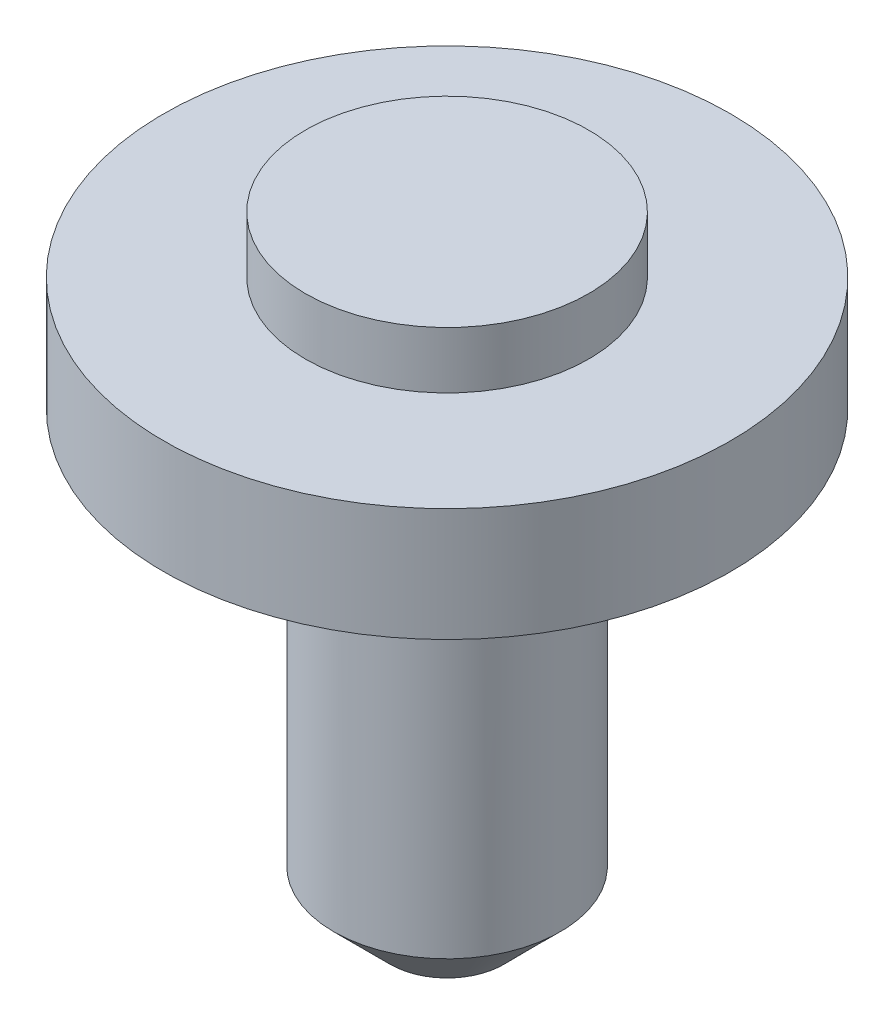
ISO-10303-21;
HEADER;
FILE_DESCRIPTION(('STEP AP214'),'2;1');
FILE_NAME('part.step','',(''),(''),'','','');
FILE_SCHEMA(('AUTOMOTIVE_DESIGN { 1 0 10303 214 1 1 1 1 }'));
ENDSEC;
DATA;
#1=APPLICATION_CONTEXT('core data for automotive mechanical design processes');
#2=APPLICATION_PROTOCOL_DEFINITION('international standard','automotive_design',2000,#1);
#3=PRODUCT_CONTEXT('',#1,'mechanical');
#4=PRODUCT('Part','Part','',(#3));
#5=PRODUCT_RELATED_PRODUCT_CATEGORY('part','',(#4));
#6=PRODUCT_DEFINITION_FORMATION('','',#4);
#7=PRODUCT_DEFINITION_CONTEXT('part definition',#1,'design');
#8=PRODUCT_DEFINITION('design','',#6,#7);
#9=PRODUCT_DEFINITION_SHAPE('','',#8);
#10=(LENGTH_UNIT() NAMED_UNIT(*) SI_UNIT(.MILLI.,.METRE.));
#11=(NAMED_UNIT(*) PLANE_ANGLE_UNIT() SI_UNIT($,.RADIAN.));
#12=(NAMED_UNIT(*) SI_UNIT($,.STERADIAN.) SOLID_ANGLE_UNIT());
#13=UNCERTAINTY_MEASURE_WITH_UNIT(LENGTH_MEASURE(1.E-05),#10,'distance_accuracy_value','');
#14=(GEOMETRIC_REPRESENTATION_CONTEXT(3) GLOBAL_UNCERTAINTY_ASSIGNED_CONTEXT((#13)) GLOBAL_UNIT_ASSIGNED_CONTEXT((#10,
#11,#12)) REPRESENTATION_CONTEXT('',''));
#15=CARTESIAN_POINT('',(0.,0.,0.));
#16=DIRECTION('',(0.,0.,1.));
#17=DIRECTION('',(1.,0.,0.));
#18=AXIS2_PLACEMENT_3D('',#15,#16,#17);
#19=CARTESIAN_POINT('',(0.,10.,0.));
#20=DIRECTION('',(0.,-1.,0.));
#21=DIRECTION('',(0.,0.,-1.));
#22=AXIS2_PLACEMENT_3D('',#19,#20,#21);
#23=PLANE('',#22);
#24=CARTESIAN_POINT('',(0.,10.,0.));
#25=DIRECTION('',(0.,1.,0.));
#26=DIRECTION('',(0.,0.,1.));
#27=AXIS2_PLACEMENT_3D('',#24,#25,#26);
#28=CIRCLE('',#27,2.5);
#29=CARTESIAN_POINT('',(0.,10.,2.5));
#30=VERTEX_POINT('',#29);
#31=EDGE_CURVE('E10',#30,#30,#28,.T.);
#32=ORIENTED_EDGE('',*,*,#31,.F.);
#33=EDGE_LOOP('',(#32));
#34=FACE_BOUND('',#33,.T.);
#35=CARTESIAN_POINT('',(0.,10.,0.));
#36=DIRECTION('',(0.,-1.,0.));
#37=DIRECTION('',(0.,0.,-1.));
#38=AXIS2_PLACEMENT_3D('',#35,#36,#37);
#39=CIRCLE('',#38,5.);
#40=CARTESIAN_POINT('',(0.,10.,-5.));
#41=VERTEX_POINT('',#40);
#42=EDGE_CURVE('E72',#41,#41,#39,.T.);
#43=ORIENTED_EDGE('',*,*,#42,.F.);
#44=EDGE_LOOP('',(#43));
#45=FACE_BOUND('',#44,.T.);
#46=ADVANCED_FACE('F37',(#34,#45),#23,.F.);
#47=CARTESIAN_POINT('',(0.,0.,0.));
#48=DIRECTION('',(0.,-1.,0.));
#49=DIRECTION('',(0.,0.,-1.));
#50=AXIS2_PLACEMENT_3D('',#47,#48,#49);
#51=CYLINDRICAL_SURFACE('',#50,5.);
#52=CARTESIAN_POINT('',(0.,8.,0.));
#53=DIRECTION('',(0.,-1.,0.));
#54=DIRECTION('',(0.,0.,-1.));
#55=AXIS2_PLACEMENT_3D('',#52,#53,#54);
#56=CIRCLE('',#55,5.);
#57=CARTESIAN_POINT('',(0.,8.,-5.));
#58=VERTEX_POINT('',#57);
#59=EDGE_CURVE('E69',#58,#58,#56,.T.);
#60=ORIENTED_EDGE('',*,*,#59,.F.);
#61=EDGE_LOOP('',(#60));
#62=FACE_BOUND('',#61,.T.);
#63=ORIENTED_EDGE('',*,*,#42,.T.);
#64=EDGE_LOOP('',(#63));
#65=FACE_BOUND('',#64,.T.);
#66=ADVANCED_FACE('F96',(#62,#65),#51,.T.);
#67=CARTESIAN_POINT('',(-5.,8.,0.));
#68=DIRECTION('',(0.,1.,0.));
#69=DIRECTION('',(0.,0.,1.));
#70=AXIS2_PLACEMENT_3D('',#67,#68,#69);
#71=PLANE('',#70);
#72=CARTESIAN_POINT('',(0.,8.,0.));
#73=DIRECTION('',(0.,-1.,0.));
#74=DIRECTION('',(0.,0.,-1.));
#75=AXIS2_PLACEMENT_3D('',#72,#73,#74);
#76=CIRCLE('',#75,2.5);
#77=CARTESIAN_POINT('',(0.,8.,-2.5));
#78=VERTEX_POINT('',#77);
#79=EDGE_CURVE('E66',#78,#78,#76,.T.);
#80=ORIENTED_EDGE('',*,*,#79,.F.);
#81=EDGE_LOOP('',(#80));
#82=FACE_BOUND('',#81,.T.);
#83=ORIENTED_EDGE('',*,*,#59,.T.);
#84=EDGE_LOOP('',(#83));
#85=FACE_BOUND('',#84,.T.);
#86=ADVANCED_FACE('F101',(#82,#85),#71,.F.);
#87=CARTESIAN_POINT('',(0.,0.,0.));
#88=DIRECTION('',(0.,-1.,0.));
#89=DIRECTION('',(0.,0.,-1.));
#90=AXIS2_PLACEMENT_3D('',#87,#88,#89);
#91=CYLINDRICAL_SURFACE('',#90,2.5);
#92=CARTESIAN_POINT('',(0.,7.,0.));
#93=DIRECTION('',(0.,-1.,0.));
#94=DIRECTION('',(0.,0.,-1.));
#95=AXIS2_PLACEMENT_3D('',#92,#93,#94);
#96=CIRCLE('',#95,2.5);
#97=CARTESIAN_POINT('',(0.,7.,-2.5));
#98=VERTEX_POINT('',#97);
#99=EDGE_CURVE('E63',#98,#98,#96,.T.);
#100=ORIENTED_EDGE('',*,*,#99,.F.);
#101=EDGE_LOOP('',(#100));
#102=FACE_BOUND('',#101,.T.);
#103=ORIENTED_EDGE('',*,*,#79,.T.);
#104=EDGE_LOOP('',(#103));
#105=FACE_BOUND('',#104,.T.);
#106=ADVANCED_FACE('F108',(#102,#105),#91,.T.);
#107=CARTESIAN_POINT('',(-2.5,7.,0.));
#108=DIRECTION('',(0.,1.,0.));
#109=DIRECTION('',(0.,0.,1.));
#110=AXIS2_PLACEMENT_3D('',#107,#108,#109);
#111=PLANE('',#110);
#112=CARTESIAN_POINT('',(0.,7.,0.));
#113=DIRECTION('',(0.,-1.,0.));
#114=DIRECTION('',(0.,0.,-1.));
#115=AXIS2_PLACEMENT_3D('',#112,#113,#114);
#116=CIRCLE('',#115,2.);
#117=CARTESIAN_POINT('',(0.,7.,-2.));
#118=VERTEX_POINT('',#117);
#119=EDGE_CURVE('E60',#118,#118,#116,.T.);
#120=ORIENTED_EDGE('',*,*,#119,.F.);
#121=EDGE_LOOP('',(#120));
#122=FACE_BOUND('',#121,.T.);
#123=ORIENTED_EDGE('',*,*,#99,.T.);
#124=EDGE_LOOP('',(#123));
#125=FACE_BOUND('',#124,.T.);
#126=ADVANCED_FACE('F112',(#122,#125),#111,.F.);
#127=CARTESIAN_POINT('',(0.,0.,0.));
#128=DIRECTION('',(0.,-1.,0.));
#129=DIRECTION('',(0.,0.,-1.));
#130=AXIS2_PLACEMENT_3D('',#127,#128,#129);
#131=CYLINDRICAL_SURFACE('',#130,2.);
#132=CARTESIAN_POINT('',(0.,0.999999999999999,0.));
#133=DIRECTION('',(0.,1.,0.));
#134=DIRECTION('',(0.,0.,1.));
#135=AXIS2_PLACEMENT_3D('',#132,#133,#134);
#136=CIRCLE('',#135,2.);
#137=CARTESIAN_POINT('',(0.,0.999999999999999,2.));
#138=VERTEX_POINT('',#137);
#139=EDGE_CURVE('E42',#138,#138,#136,.T.);
#140=ORIENTED_EDGE('',*,*,#139,.T.);
#141=EDGE_LOOP('',(#140));
#142=FACE_BOUND('',#141,.T.);
#143=ORIENTED_EDGE('',*,*,#119,.T.);
#144=EDGE_LOOP('',(#143));
#145=FACE_BOUND('',#144,.T.);
#146=ADVANCED_FACE('F116',(#142,#145),#131,.T.);
#147=CARTESIAN_POINT('',(-2.,0.,0.));
#148=DIRECTION('',(0.,1.,0.));
#149=DIRECTION('',(0.,0.,1.));
#150=AXIS2_PLACEMENT_3D('',#147,#148,#149);
#151=PLANE('',#150);
#152=CARTESIAN_POINT('',(0.,0.,0.));
#153=DIRECTION('',(0.,1.,0.));
#154=DIRECTION('',(0.,0.,1.));
#155=AXIS2_PLACEMENT_3D('',#152,#153,#154);
#156=CIRCLE('',#155,1.);
#157=CARTESIAN_POINT('',(0.,0.,1.));
#158=VERTEX_POINT('',#157);
#159=EDGE_CURVE('E50',#158,#158,#156,.F.);
#160=ORIENTED_EDGE('',*,*,#159,.T.);
#161=EDGE_LOOP('',(#160));
#162=FACE_BOUND('',#161,.T.);
#163=CARTESIAN_POINT('',(0.,0.,0.));
#164=DIRECTION('',(0.,-1.,0.));
#165=DIRECTION('',(0.,0.,-1.));
#166=AXIS2_PLACEMENT_3D('',#163,#164,#165);
#167=CIRCLE('',#166,0.35);
#168=CARTESIAN_POINT('',(0.,0.,-0.35));
#169=VERTEX_POINT('',#168);
#170=EDGE_CURVE('E57',#169,#169,#167,.T.);
#171=ORIENTED_EDGE('',*,*,#170,.F.);
#172=EDGE_LOOP('',(#171));
#173=FACE_BOUND('',#172,.T.);
#174=ADVANCED_FACE('F77',(#162,#173),#151,.F.);
#175=CARTESIAN_POINT('',(0.,0.,0.));
#176=DIRECTION('',(0.,-1.,0.));
#177=DIRECTION('',(0.,0.,-1.));
#178=AXIS2_PLACEMENT_3D('',#175,#176,#177);
#179=CYLINDRICAL_SURFACE('',#178,0.35);
#180=CARTESIAN_POINT('',(0.,9.,0.));
#181=DIRECTION('',(0.,-1.,0.));
#182=DIRECTION('',(0.,0.,-1.));
#183=AXIS2_PLACEMENT_3D('',#180,#181,#182);
#184=CIRCLE('',#183,0.35);
#185=CARTESIAN_POINT('',(0.,9.,-0.35));
#186=VERTEX_POINT('',#185);
#187=EDGE_CURVE('E54',#186,#186,#184,.T.);
#188=ORIENTED_EDGE('',*,*,#187,.F.);
#189=EDGE_LOOP('',(#188));
#190=FACE_BOUND('',#189,.T.);
#191=ORIENTED_EDGE('',*,*,#170,.T.);
#192=EDGE_LOOP('',(#191));
#193=FACE_BOUND('',#192,.T.);
#194=ADVANCED_FACE('F91',(#190,#193),#179,.F.);
#195=CARTESIAN_POINT('',(-0.35,9.,0.));
#196=DIRECTION('',(0.,1.,0.));
#197=DIRECTION('',(0.,0.,1.));
#198=AXIS2_PLACEMENT_3D('',#195,#196,#197);
#199=PLANE('',#198);
#200=ORIENTED_EDGE('',*,*,#187,.T.);
#201=EDGE_LOOP('',(#200));
#202=FACE_BOUND('',#201,.T.);
#203=ADVANCED_FACE('F82',(#202),#199,.F.);
#204=CARTESIAN_POINT('',(0.,0.,0.));
#205=DIRECTION('',(0.,1.,0.));
#206=DIRECTION('',(0.,0.,1.));
#207=AXIS2_PLACEMENT_3D('',#204,#205,#206);
#208=CONICAL_SURFACE('',#207,1.,0.785398163397447);
#209=ORIENTED_EDGE('',*,*,#139,.F.);
#210=EDGE_LOOP('',(#209));
#211=FACE_BOUND('',#210,.T.);
#212=ORIENTED_EDGE('',*,*,#159,.F.);
#213=EDGE_LOOP('',(#212));
#214=FACE_BOUND('',#213,.T.);
#215=ADVANCED_FACE('F40',(#211,#214),#208,.T.);
#216=CARTESIAN_POINT('',(0.,11.,0.));
#217=DIRECTION('',(0.,-1.,0.));
#218=DIRECTION('',(0.,0.,-1.));
#219=AXIS2_PLACEMENT_3D('',#216,#217,#218);
#220=CYLINDRICAL_SURFACE('',#219,2.5);
#221=CARTESIAN_POINT('',(0.,11.,0.));
#222=DIRECTION('',(0.,1.,0.));
#223=DIRECTION('',(0.,0.,1.));
#224=AXIS2_PLACEMENT_3D('',#221,#222,#223);
#225=CIRCLE('',#224,2.5);
#226=CARTESIAN_POINT('',(0.,11.,2.5));
#227=VERTEX_POINT('',#226);
#228=EDGE_CURVE('E53',#227,#227,#225,.T.);
#229=ORIENTED_EDGE('',*,*,#228,.F.);
#230=EDGE_LOOP('',(#229));
#231=FACE_BOUND('',#230,.T.);
#232=ORIENTED_EDGE('',*,*,#31,.T.);
#233=EDGE_LOOP('',(#232));
#234=FACE_BOUND('',#233,.T.);
#235=ADVANCED_FACE('F81',(#231,#234),#220,.T.);
#236=CARTESIAN_POINT('',(0.,11.,0.));
#237=DIRECTION('',(0.,1.,0.));
#238=DIRECTION('',(0.,0.,1.));
#239=AXIS2_PLACEMENT_3D('',#236,#237,#238);
#240=PLANE('',#239);
#241=ORIENTED_EDGE('',*,*,#228,.T.);
#242=EDGE_LOOP('',(#241));
#243=FACE_BOUND('',#242,.T.);
#244=ADVANCED_FACE('F88',(#243),#240,.T.);
#245=CLOSED_SHELL('',(#46,#66,#86,#106,#126,#146,#174,#194,#203,#215,#235,#244));
#246=MANIFOLD_SOLID_BREP('B2',#245);
#247=ADVANCED_BREP_SHAPE_REPRESENTATION('',(#18,#246),#14);
#248=SHAPE_DEFINITION_REPRESENTATION(#9,#247);
ENDSEC;
END-ISO-10303-21;
